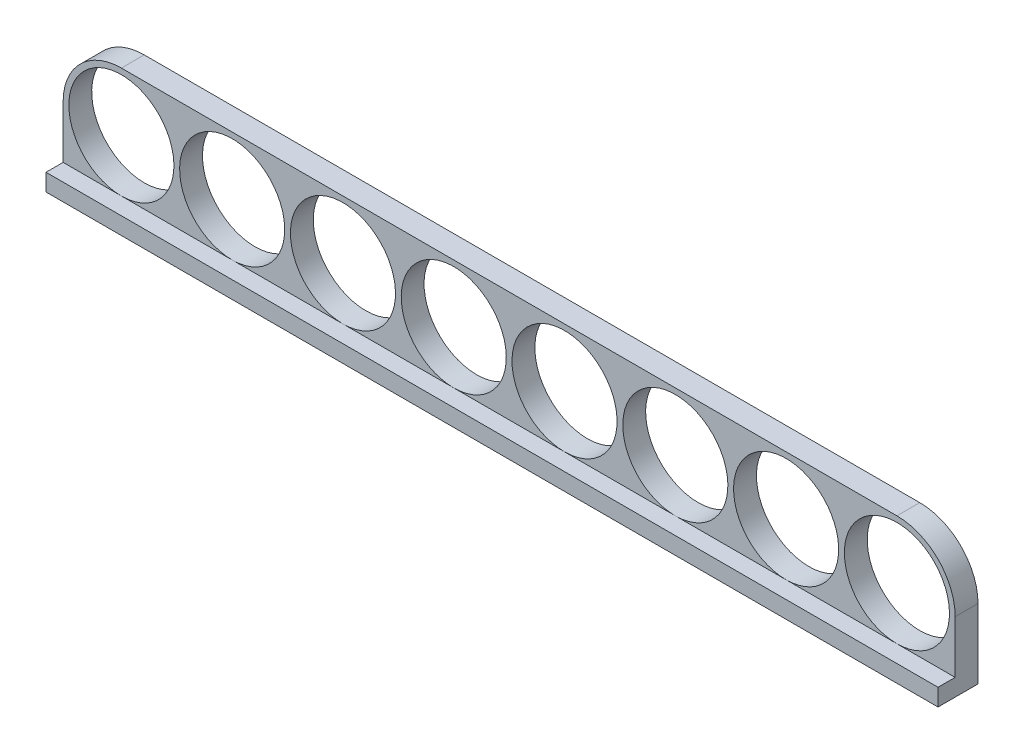
ISO-10303-21;
HEADER;
FILE_DESCRIPTION(('STEP AP214'),'2;1');
FILE_NAME('part.step','',(''),(''),'','','');
FILE_SCHEMA(('AUTOMOTIVE_DESIGN { 1 0 10303 214 1 1 1 1 }'));
ENDSEC;
DATA;
#1=APPLICATION_CONTEXT('core data for automotive mechanical design processes');
#2=APPLICATION_PROTOCOL_DEFINITION('international standard','automotive_design',2000,#1);
#3=PRODUCT_CONTEXT('',#1,'mechanical');
#4=PRODUCT('Part','Part','',(#3));
#5=PRODUCT_RELATED_PRODUCT_CATEGORY('part','',(#4));
#6=PRODUCT_DEFINITION_FORMATION('','',#4);
#7=PRODUCT_DEFINITION_CONTEXT('part definition',#1,'design');
#8=PRODUCT_DEFINITION('design','',#6,#7);
#9=PRODUCT_DEFINITION_SHAPE('','',#8);
#10=(LENGTH_UNIT() NAMED_UNIT(*) SI_UNIT(.MILLI.,.METRE.));
#11=(NAMED_UNIT(*) PLANE_ANGLE_UNIT() SI_UNIT($,.RADIAN.));
#12=(NAMED_UNIT(*) SI_UNIT($,.STERADIAN.) SOLID_ANGLE_UNIT());
#13=UNCERTAINTY_MEASURE_WITH_UNIT(LENGTH_MEASURE(1.E-05),#10,'distance_accuracy_value','');
#14=(GEOMETRIC_REPRESENTATION_CONTEXT(3) GLOBAL_UNCERTAINTY_ASSIGNED_CONTEXT((#13)) GLOBAL_UNIT_ASSIGNED_CONTEXT((#10,
#11,#12)) REPRESENTATION_CONTEXT('',''));
#15=CARTESIAN_POINT('',(0.,0.,0.));
#16=DIRECTION('',(0.,0.,1.));
#17=DIRECTION('',(1.,0.,0.));
#18=AXIS2_PLACEMENT_3D('',#15,#16,#17);
#19=CARTESIAN_POINT('',(0.,10.2,4.));
#20=DIRECTION('',(0.,1.,0.));
#21=DIRECTION('',(0.,0.,1.));
#22=AXIS2_PLACEMENT_3D('',#19,#20,#21);
#23=PLANE('',#22);
#24=DIRECTION('',(1.,0.,0.));
#25=VECTOR('',#24,1.);
#26=CARTESIAN_POINT('',(0.,10.2,0.));
#27=LINE('',#26,#25);
#28=CARTESIAN_POINT('',(0.,10.2,0.));
#29=VERTEX_POINT('',#28);
#30=CARTESIAN_POINT('',(135.8,10.2,0.));
#31=VERTEX_POINT('',#30);
#32=EDGE_CURVE('E265',#29,#31,#27,.T.);
#33=ORIENTED_EDGE('',*,*,#32,.F.);
#34=DIRECTION('',(0.,0.,-1.));
#35=VECTOR('',#34,1.);
#36=CARTESIAN_POINT('',(0.,10.2,4.));
#37=LINE('',#36,#35);
#38=CARTESIAN_POINT('',(0.,10.2,4.));
#39=VERTEX_POINT('',#38);
#40=EDGE_CURVE('E51',#39,#29,#37,.T.);
#41=ORIENTED_EDGE('',*,*,#40,.F.);
#42=DIRECTION('',(1.,0.,0.));
#43=VECTOR('',#42,1.);
#44=CARTESIAN_POINT('',(0.,10.2,4.));
#45=LINE('',#44,#43);
#46=CARTESIAN_POINT('',(135.8,10.2,4.));
#47=VERTEX_POINT('',#46);
#48=EDGE_CURVE('E215',#39,#47,#45,.T.);
#49=ORIENTED_EDGE('',*,*,#48,.T.);
#50=DIRECTION('',(0.,0.,-1.));
#51=VECTOR('',#50,1.);
#52=CARTESIAN_POINT('',(135.8,10.2,4.));
#53=LINE('',#52,#51);
#54=EDGE_CURVE('E233',#47,#31,#53,.T.);
#55=ORIENTED_EDGE('',*,*,#54,.T.);
#56=EDGE_LOOP('',(#33,#41,#49,#55));
#57=FACE_BOUND('',#56,.T.);
#58=ADVANCED_FACE('F47',(#57),#23,.T.);
#59=CARTESIAN_POINT('',(0.,0.,4.));
#60=DIRECTION('',(0.,0.,-1.));
#61=DIRECTION('',(-1.,0.,0.));
#62=AXIS2_PLACEMENT_3D('',#59,#60,#61);
#63=CYLINDRICAL_SURFACE('',#62,10.2);
#64=CARTESIAN_POINT('',(0.,0.,0.));
#65=DIRECTION('',(0.,0.,1.));
#66=DIRECTION('',(1.,0.,0.));
#67=AXIS2_PLACEMENT_3D('',#64,#65,#66);
#68=CIRCLE('',#67,10.2);
#69=CARTESIAN_POINT('',(-10.2,0.,0.));
#70=VERTEX_POINT('',#69);
#71=EDGE_CURVE('E269',#29,#70,#68,.T.);
#72=ORIENTED_EDGE('',*,*,#71,.T.);
#73=DIRECTION('',(0.,0.,-1.));
#74=VECTOR('',#73,1.);
#75=CARTESIAN_POINT('',(-10.2,0.,4.));
#76=LINE('',#75,#74);
#77=CARTESIAN_POINT('',(-10.2,0.,4.));
#78=VERTEX_POINT('',#77);
#79=EDGE_CURVE('E150',#78,#70,#76,.T.);
#80=ORIENTED_EDGE('',*,*,#79,.F.);
#81=CARTESIAN_POINT('',(0.,0.,4.));
#82=DIRECTION('',(0.,0.,1.));
#83=DIRECTION('',(1.,0.,0.));
#84=AXIS2_PLACEMENT_3D('',#81,#82,#83);
#85=CIRCLE('',#84,10.2);
#86=EDGE_CURVE('E219',#39,#78,#85,.T.);
#87=ORIENTED_EDGE('',*,*,#86,.F.);
#88=ORIENTED_EDGE('',*,*,#40,.T.);
#89=EDGE_LOOP('',(#72,#80,#87,#88));
#90=FACE_BOUND('',#89,.T.);
#91=ADVANCED_FACE('F347',(#90),#63,.T.);
#92=CARTESIAN_POINT('',(-10.2,0.,4.));
#93=DIRECTION('',(1.,0.,0.));
#94=DIRECTION('',(0.,1.,0.));
#95=AXIS2_PLACEMENT_3D('',#92,#93,#94);
#96=PLANE('',#95);
#97=DIRECTION('',(0.,-1.,0.));
#98=VECTOR('',#97,1.);
#99=CARTESIAN_POINT('',(-10.2,0.,0.));
#100=LINE('',#99,#98);
#101=CARTESIAN_POINT('',(-10.2,-12.2,0.));
#102=VERTEX_POINT('',#101);
#103=EDGE_CURVE('E146',#70,#102,#100,.T.);
#104=ORIENTED_EDGE('',*,*,#103,.T.);
#105=DIRECTION('',(0.,0.,-1.));
#106=VECTOR('',#105,1.);
#107=CARTESIAN_POINT('',(-10.2,-12.2,4.));
#108=LINE('',#107,#106);
#109=CARTESIAN_POINT('',(-10.2,-12.2,7.));
#110=VERTEX_POINT('',#109);
#111=EDGE_CURVE('E139',#110,#102,#108,.T.);
#112=ORIENTED_EDGE('',*,*,#111,.F.);
#113=DIRECTION('',(0.,-1.,0.));
#114=VECTOR('',#113,1.);
#115=CARTESIAN_POINT('',(-10.2,-12.2,7.));
#116=LINE('',#115,#114);
#117=CARTESIAN_POINT('',(-10.2,-9.2,7.));
#118=VERTEX_POINT('',#117);
#119=EDGE_CURVE('E144',#118,#110,#116,.T.);
#120=ORIENTED_EDGE('',*,*,#119,.F.);
#121=DIRECTION('',(0.,0.,-1.));
#122=VECTOR('',#121,1.);
#123=CARTESIAN_POINT('',(-10.2,-9.2,7.));
#124=LINE('',#123,#122);
#125=CARTESIAN_POINT('',(-10.2,-9.2,4.));
#126=VERTEX_POINT('',#125);
#127=EDGE_CURVE('E174',#118,#126,#124,.T.);
#128=ORIENTED_EDGE('',*,*,#127,.T.);
#129=DIRECTION('',(0.,-1.,0.));
#130=VECTOR('',#129,1.);
#131=CARTESIAN_POINT('',(-10.2,0.,4.));
#132=LINE('',#131,#130);
#133=EDGE_CURVE('E223',#78,#126,#132,.T.);
#134=ORIENTED_EDGE('',*,*,#133,.F.);
#135=ORIENTED_EDGE('',*,*,#79,.T.);
#136=EDGE_LOOP('',(#104,#112,#120,#128,#134,#135));
#137=FACE_BOUND('',#136,.T.);
#138=ADVANCED_FACE('F141',(#137),#96,.F.);
#139=CARTESIAN_POINT('',(0.,-12.2,4.));
#140=DIRECTION('',(0.,1.,0.));
#141=DIRECTION('',(0.,0.,1.));
#142=AXIS2_PLACEMENT_3D('',#139,#140,#141);
#143=PLANE('',#142);
#144=DIRECTION('',(1.,0.,0.));
#145=VECTOR('',#144,1.);
#146=CARTESIAN_POINT('',(0.,-12.2,0.));
#147=LINE('',#146,#145);
#148=CARTESIAN_POINT('',(146.,-12.2,0.));
#149=VERTEX_POINT('',#148);
#150=EDGE_CURVE('E275',#102,#149,#147,.T.);
#151=ORIENTED_EDGE('',*,*,#150,.T.);
#152=DIRECTION('',(0.,0.,-1.));
#153=VECTOR('',#152,1.);
#154=CARTESIAN_POINT('',(146.,-12.2,4.));
#155=LINE('',#154,#153);
#156=CARTESIAN_POINT('',(146.,-12.2,7.));
#157=VERTEX_POINT('',#156);
#158=EDGE_CURVE('E151',#157,#149,#155,.T.);
#159=ORIENTED_EDGE('',*,*,#158,.F.);
#160=DIRECTION('',(1.,0.,0.));
#161=VECTOR('',#160,1.);
#162=CARTESIAN_POINT('',(-10.2,-12.2,7.));
#163=LINE('',#162,#161);
#164=EDGE_CURVE('E154',#110,#157,#163,.T.);
#165=ORIENTED_EDGE('',*,*,#164,.F.);
#166=ORIENTED_EDGE('',*,*,#111,.T.);
#167=EDGE_LOOP('',(#151,#159,#165,#166));
#168=FACE_BOUND('',#167,.T.);
#169=ADVANCED_FACE('F155',(#168),#143,.F.);
#170=CARTESIAN_POINT('',(146.,0.,4.));
#171=DIRECTION('',(-1.,0.,0.));
#172=DIRECTION('',(0.,0.,1.));
#173=AXIS2_PLACEMENT_3D('',#170,#171,#172);
#174=PLANE('',#173);
#175=DIRECTION('',(0.,1.,0.));
#176=VECTOR('',#175,1.);
#177=CARTESIAN_POINT('',(146.,0.,0.));
#178=LINE('',#177,#176);
#179=CARTESIAN_POINT('',(146.,0.,0.));
#180=VERTEX_POINT('',#179);
#181=EDGE_CURVE('E278',#149,#180,#178,.T.);
#182=ORIENTED_EDGE('',*,*,#181,.T.);
#183=DIRECTION('',(0.,0.,-1.));
#184=VECTOR('',#183,1.);
#185=CARTESIAN_POINT('',(146.,0.,4.));
#186=LINE('',#185,#184);
#187=CARTESIAN_POINT('',(146.,0.,4.));
#188=VERTEX_POINT('',#187);
#189=EDGE_CURVE('E287',#188,#180,#186,.T.);
#190=ORIENTED_EDGE('',*,*,#189,.F.);
#191=DIRECTION('',(0.,1.,0.));
#192=VECTOR('',#191,1.);
#193=CARTESIAN_POINT('',(146.,0.,4.));
#194=LINE('',#193,#192);
#195=CARTESIAN_POINT('',(146.,-9.2,4.));
#196=VERTEX_POINT('',#195);
#197=EDGE_CURVE('E226',#196,#188,#194,.T.);
#198=ORIENTED_EDGE('',*,*,#197,.F.);
#199=DIRECTION('',(0.,0.,-1.));
#200=VECTOR('',#199,1.);
#201=CARTESIAN_POINT('',(146.,-9.2,7.));
#202=LINE('',#201,#200);
#203=CARTESIAN_POINT('',(146.,-9.2,7.));
#204=VERTEX_POINT('',#203);
#205=EDGE_CURVE('E178',#204,#196,#202,.T.);
#206=ORIENTED_EDGE('',*,*,#205,.F.);
#207=DIRECTION('',(0.,1.,0.));
#208=VECTOR('',#207,1.);
#209=CARTESIAN_POINT('',(146.,-12.2,7.));
#210=LINE('',#209,#208);
#211=EDGE_CURVE('E160',#157,#204,#210,.T.);
#212=ORIENTED_EDGE('',*,*,#211,.F.);
#213=ORIENTED_EDGE('',*,*,#158,.T.);
#214=EDGE_LOOP('',(#182,#190,#198,#206,#212,#213));
#215=FACE_BOUND('',#214,.T.);
#216=ADVANCED_FACE('F344',(#215),#174,.F.);
#217=CARTESIAN_POINT('',(135.8,0.,4.));
#218=DIRECTION('',(0.,0.,-1.));
#219=DIRECTION('',(-1.,0.,0.));
#220=AXIS2_PLACEMENT_3D('',#217,#218,#219);
#221=CYLINDRICAL_SURFACE('',#220,9.2);
#222=CARTESIAN_POINT('',(135.8,0.,4.));
#223=DIRECTION('',(0.,0.,1.));
#224=DIRECTION('',(1.,0.,0.));
#225=AXIS2_PLACEMENT_3D('',#222,#223,#224);
#226=CIRCLE('',#225,9.2);
#227=CARTESIAN_POINT('',(135.8,-9.2,4.));
#228=VERTEX_POINT('',#227);
#229=EDGE_CURVE('E212',#228,#228,#226,.T.);
#230=ORIENTED_EDGE('',*,*,#229,.T.);
#231=EDGE_LOOP('',(#230));
#232=FACE_BOUND('',#231,.T.);
#233=CARTESIAN_POINT('',(135.8,0.,0.));
#234=DIRECTION('',(0.,0.,1.));
#235=DIRECTION('',(1.,0.,0.));
#236=AXIS2_PLACEMENT_3D('',#233,#234,#235);
#237=CIRCLE('',#236,9.2);
#238=CARTESIAN_POINT('',(145.,0.,0.));
#239=VERTEX_POINT('',#238);
#240=EDGE_CURVE('E261',#239,#239,#237,.T.);
#241=ORIENTED_EDGE('',*,*,#240,.F.);
#242=EDGE_LOOP('',(#241));
#243=FACE_BOUND('',#242,.T.);
#244=ADVANCED_FACE('F325',(#232,#243),#221,.F.);
#245=CARTESIAN_POINT('',(116.4,0.,4.));
#246=DIRECTION('',(0.,0.,-1.));
#247=DIRECTION('',(-1.,0.,0.));
#248=AXIS2_PLACEMENT_3D('',#245,#246,#247);
#249=CYLINDRICAL_SURFACE('',#248,9.2);
#250=CARTESIAN_POINT('',(116.4,0.,4.));
#251=DIRECTION('',(0.,0.,1.));
#252=DIRECTION('',(1.,0.,0.));
#253=AXIS2_PLACEMENT_3D('',#250,#251,#252);
#254=CIRCLE('',#253,9.2);
#255=CARTESIAN_POINT('',(116.4,-9.2,4.));
#256=VERTEX_POINT('',#255);
#257=EDGE_CURVE('E208',#256,#256,#254,.T.);
#258=ORIENTED_EDGE('',*,*,#257,.T.);
#259=EDGE_LOOP('',(#258));
#260=FACE_BOUND('',#259,.T.);
#261=CARTESIAN_POINT('',(116.4,0.,0.));
#262=DIRECTION('',(0.,0.,1.));
#263=DIRECTION('',(1.,0.,0.));
#264=AXIS2_PLACEMENT_3D('',#261,#262,#263);
#265=CIRCLE('',#264,9.2);
#266=CARTESIAN_POINT('',(125.6,0.,0.));
#267=VERTEX_POINT('',#266);
#268=EDGE_CURVE('E257',#267,#267,#265,.T.);
#269=ORIENTED_EDGE('',*,*,#268,.F.);
#270=EDGE_LOOP('',(#269));
#271=FACE_BOUND('',#270,.T.);
#272=ADVANCED_FACE('F321',(#260,#271),#249,.F.);
#273=CARTESIAN_POINT('',(97.,0.,4.));
#274=DIRECTION('',(0.,0.,-1.));
#275=DIRECTION('',(-1.,0.,0.));
#276=AXIS2_PLACEMENT_3D('',#273,#274,#275);
#277=CYLINDRICAL_SURFACE('',#276,9.2);
#278=CARTESIAN_POINT('',(97.,0.,4.));
#279=DIRECTION('',(0.,0.,1.));
#280=DIRECTION('',(1.,0.,0.));
#281=AXIS2_PLACEMENT_3D('',#278,#279,#280);
#282=CIRCLE('',#281,9.2);
#283=CARTESIAN_POINT('',(97.,-9.2,4.));
#284=VERTEX_POINT('',#283);
#285=EDGE_CURVE('E204',#284,#284,#282,.T.);
#286=ORIENTED_EDGE('',*,*,#285,.T.);
#287=EDGE_LOOP('',(#286));
#288=FACE_BOUND('',#287,.T.);
#289=CARTESIAN_POINT('',(97.,0.,0.));
#290=DIRECTION('',(0.,0.,1.));
#291=DIRECTION('',(1.,0.,0.));
#292=AXIS2_PLACEMENT_3D('',#289,#290,#291);
#293=CIRCLE('',#292,9.2);
#294=CARTESIAN_POINT('',(106.2,0.,0.));
#295=VERTEX_POINT('',#294);
#296=EDGE_CURVE('E253',#295,#295,#293,.T.);
#297=ORIENTED_EDGE('',*,*,#296,.F.);
#298=EDGE_LOOP('',(#297));
#299=FACE_BOUND('',#298,.T.);
#300=ADVANCED_FACE('F324',(#288,#299),#277,.F.);
#301=CARTESIAN_POINT('',(77.6,0.,4.));
#302=DIRECTION('',(0.,0.,-1.));
#303=DIRECTION('',(-1.,0.,0.));
#304=AXIS2_PLACEMENT_3D('',#301,#302,#303);
#305=CYLINDRICAL_SURFACE('',#304,9.2);
#306=CARTESIAN_POINT('',(77.6,0.,4.));
#307=DIRECTION('',(0.,0.,1.));
#308=DIRECTION('',(1.,0.,0.));
#309=AXIS2_PLACEMENT_3D('',#306,#307,#308);
#310=CIRCLE('',#309,9.2);
#311=CARTESIAN_POINT('',(77.6,-9.2,4.));
#312=VERTEX_POINT('',#311);
#313=EDGE_CURVE('E200',#312,#312,#310,.T.);
#314=ORIENTED_EDGE('',*,*,#313,.T.);
#315=EDGE_LOOP('',(#314));
#316=FACE_BOUND('',#315,.T.);
#317=CARTESIAN_POINT('',(77.6,0.,0.));
#318=DIRECTION('',(0.,0.,1.));
#319=DIRECTION('',(1.,0.,0.));
#320=AXIS2_PLACEMENT_3D('',#317,#318,#319);
#321=CIRCLE('',#320,9.2);
#322=CARTESIAN_POINT('',(86.8,0.,0.));
#323=VERTEX_POINT('',#322);
#324=EDGE_CURVE('E249',#323,#323,#321,.T.);
#325=ORIENTED_EDGE('',*,*,#324,.F.);
#326=EDGE_LOOP('',(#325));
#327=FACE_BOUND('',#326,.T.);
#328=ADVANCED_FACE('F363',(#316,#327),#305,.F.);
#329=CARTESIAN_POINT('',(58.2,0.,4.));
#330=DIRECTION('',(0.,0.,-1.));
#331=DIRECTION('',(-1.,0.,0.));
#332=AXIS2_PLACEMENT_3D('',#329,#330,#331);
#333=CYLINDRICAL_SURFACE('',#332,9.2);
#334=CARTESIAN_POINT('',(58.2,0.,4.));
#335=DIRECTION('',(0.,0.,1.));
#336=DIRECTION('',(1.,0.,0.));
#337=AXIS2_PLACEMENT_3D('',#334,#335,#336);
#338=CIRCLE('',#337,9.2);
#339=CARTESIAN_POINT('',(58.2,-9.2,4.));
#340=VERTEX_POINT('',#339);
#341=EDGE_CURVE('E196',#340,#340,#338,.T.);
#342=ORIENTED_EDGE('',*,*,#341,.T.);
#343=EDGE_LOOP('',(#342));
#344=FACE_BOUND('',#343,.T.);
#345=CARTESIAN_POINT('',(58.2,0.,0.));
#346=DIRECTION('',(0.,0.,1.));
#347=DIRECTION('',(1.,0.,0.));
#348=AXIS2_PLACEMENT_3D('',#345,#346,#347);
#349=CIRCLE('',#348,9.2);
#350=CARTESIAN_POINT('',(67.4,0.,0.));
#351=VERTEX_POINT('',#350);
#352=EDGE_CURVE('E245',#351,#351,#349,.T.);
#353=ORIENTED_EDGE('',*,*,#352,.F.);
#354=EDGE_LOOP('',(#353));
#355=FACE_BOUND('',#354,.T.);
#356=ADVANCED_FACE('F367',(#344,#355),#333,.F.);
#357=CARTESIAN_POINT('',(38.8,0.,4.));
#358=DIRECTION('',(0.,0.,-1.));
#359=DIRECTION('',(-1.,0.,0.));
#360=AXIS2_PLACEMENT_3D('',#357,#358,#359);
#361=CYLINDRICAL_SURFACE('',#360,9.2);
#362=CARTESIAN_POINT('',(38.8,0.,4.));
#363=DIRECTION('',(0.,0.,1.));
#364=DIRECTION('',(1.,0.,0.));
#365=AXIS2_PLACEMENT_3D('',#362,#363,#364);
#366=CIRCLE('',#365,9.2);
#367=CARTESIAN_POINT('',(38.8,-9.2,4.));
#368=VERTEX_POINT('',#367);
#369=EDGE_CURVE('E192',#368,#368,#366,.T.);
#370=ORIENTED_EDGE('',*,*,#369,.T.);
#371=EDGE_LOOP('',(#370));
#372=FACE_BOUND('',#371,.T.);
#373=CARTESIAN_POINT('',(38.8,0.,0.));
#374=DIRECTION('',(0.,0.,1.));
#375=DIRECTION('',(1.,0.,0.));
#376=AXIS2_PLACEMENT_3D('',#373,#374,#375);
#377=CIRCLE('',#376,9.2);
#378=CARTESIAN_POINT('',(48.,0.,0.));
#379=VERTEX_POINT('',#378);
#380=EDGE_CURVE('E241',#379,#379,#377,.T.);
#381=ORIENTED_EDGE('',*,*,#380,.F.);
#382=EDGE_LOOP('',(#381));
#383=FACE_BOUND('',#382,.T.);
#384=ADVANCED_FACE('F371',(#372,#383),#361,.F.);
#385=CARTESIAN_POINT('',(19.4,0.,4.));
#386=DIRECTION('',(0.,0.,-1.));
#387=DIRECTION('',(-1.,0.,0.));
#388=AXIS2_PLACEMENT_3D('',#385,#386,#387);
#389=CYLINDRICAL_SURFACE('',#388,9.2);
#390=CARTESIAN_POINT('',(19.4,0.,4.));
#391=DIRECTION('',(0.,0.,1.));
#392=DIRECTION('',(1.,0.,0.));
#393=AXIS2_PLACEMENT_3D('',#390,#391,#392);
#394=CIRCLE('',#393,9.2);
#395=CARTESIAN_POINT('',(19.4,-9.2,4.));
#396=VERTEX_POINT('',#395);
#397=EDGE_CURVE('E187',#396,#396,#394,.T.);
#398=ORIENTED_EDGE('',*,*,#397,.T.);
#399=EDGE_LOOP('',(#398));
#400=FACE_BOUND('',#399,.T.);
#401=CARTESIAN_POINT('',(19.4,0.,0.));
#402=DIRECTION('',(0.,0.,1.));
#403=DIRECTION('',(1.,0.,0.));
#404=AXIS2_PLACEMENT_3D('',#401,#402,#403);
#405=CIRCLE('',#404,9.2);
#406=CARTESIAN_POINT('',(28.6,0.,0.));
#407=VERTEX_POINT('',#406);
#408=EDGE_CURVE('E237',#407,#407,#405,.T.);
#409=ORIENTED_EDGE('',*,*,#408,.F.);
#410=EDGE_LOOP('',(#409));
#411=FACE_BOUND('',#410,.T.);
#412=ADVANCED_FACE('F374',(#400,#411),#389,.F.);
#413=CARTESIAN_POINT('',(0.,0.,4.));
#414=DIRECTION('',(0.,0.,-1.));
#415=DIRECTION('',(-1.,0.,0.));
#416=AXIS2_PLACEMENT_3D('',#413,#414,#415);
#417=CYLINDRICAL_SURFACE('',#416,9.2);
#418=CARTESIAN_POINT('',(0.,0.,4.));
#419=DIRECTION('',(0.,0.,1.));
#420=DIRECTION('',(1.,0.,0.));
#421=AXIS2_PLACEMENT_3D('',#418,#419,#420);
#422=CIRCLE('',#421,9.2);
#423=CARTESIAN_POINT('',(0.,-9.2,4.));
#424=VERTEX_POINT('',#423);
#425=EDGE_CURVE('E183',#424,#424,#422,.T.);
#426=ORIENTED_EDGE('',*,*,#425,.T.);
#427=EDGE_LOOP('',(#426));
#428=FACE_BOUND('',#427,.T.);
#429=CARTESIAN_POINT('',(0.,0.,0.));
#430=DIRECTION('',(0.,0.,1.));
#431=DIRECTION('',(1.,0.,0.));
#432=AXIS2_PLACEMENT_3D('',#429,#430,#431);
#433=CIRCLE('',#432,9.2);
#434=CARTESIAN_POINT('',(9.2,0.,0.));
#435=VERTEX_POINT('',#434);
#436=EDGE_CURVE('E182',#435,#435,#433,.T.);
#437=ORIENTED_EDGE('',*,*,#436,.F.);
#438=EDGE_LOOP('',(#437));
#439=FACE_BOUND('',#438,.T.);
#440=ADVANCED_FACE('F49',(#428,#439),#417,.F.);
#441=CARTESIAN_POINT('',(135.8,0.,4.));
#442=DIRECTION('',(0.,0.,-1.));
#443=DIRECTION('',(-1.,0.,0.));
#444=AXIS2_PLACEMENT_3D('',#441,#442,#443);
#445=CYLINDRICAL_SURFACE('',#444,10.2);
#446=CARTESIAN_POINT('',(135.8,0.,0.));
#447=DIRECTION('',(0.,0.,1.));
#448=DIRECTION('',(1.,0.,0.));
#449=AXIS2_PLACEMENT_3D('',#446,#447,#448);
#450=CIRCLE('',#449,10.2);
#451=EDGE_CURVE('E188',#31,#180,#450,.F.);
#452=ORIENTED_EDGE('',*,*,#451,.F.);
#453=ORIENTED_EDGE('',*,*,#54,.F.);
#454=CARTESIAN_POINT('',(135.8,0.,4.));
#455=DIRECTION('',(0.,0.,1.));
#456=DIRECTION('',(1.,0.,0.));
#457=AXIS2_PLACEMENT_3D('',#454,#455,#456);
#458=CIRCLE('',#457,10.2);
#459=EDGE_CURVE('E229',#47,#188,#458,.F.);
#460=ORIENTED_EDGE('',*,*,#459,.T.);
#461=ORIENTED_EDGE('',*,*,#189,.T.);
#462=EDGE_LOOP('',(#452,#453,#460,#461));
#463=FACE_BOUND('',#462,.T.);
#464=ADVANCED_FACE('F340',(#463),#445,.T.);
#465=CARTESIAN_POINT('',(0.,0.,4.));
#466=DIRECTION('',(0.,0.,1.));
#467=DIRECTION('',(1.,0.,0.));
#468=AXIS2_PLACEMENT_3D('',#465,#466,#467);
#469=PLANE('',#468);
#470=DIRECTION('',(-1.,0.,0.));
#471=VECTOR('',#470,1.);
#472=CARTESIAN_POINT('',(-10.2,-9.2,4.));
#473=LINE('',#472,#471);
#474=EDGE_CURVE('E59',#196,#228,#473,.T.);
#475=ORIENTED_EDGE('',*,*,#474,.F.);
#476=ORIENTED_EDGE('',*,*,#197,.T.);
#477=ORIENTED_EDGE('',*,*,#459,.F.);
#478=ORIENTED_EDGE('',*,*,#48,.F.);
#479=ORIENTED_EDGE('',*,*,#86,.T.);
#480=ORIENTED_EDGE('',*,*,#133,.T.);
#481=EDGE_CURVE('E169',#424,#126,#473,.T.);
#482=ORIENTED_EDGE('',*,*,#481,.F.);
#483=ORIENTED_EDGE('',*,*,#425,.F.);
#484=EDGE_CURVE('E299',#396,#424,#473,.T.);
#485=ORIENTED_EDGE('',*,*,#484,.F.);
#486=ORIENTED_EDGE('',*,*,#397,.F.);
#487=EDGE_CURVE('E303',#368,#396,#473,.T.);
#488=ORIENTED_EDGE('',*,*,#487,.F.);
#489=ORIENTED_EDGE('',*,*,#369,.F.);
#490=EDGE_CURVE('E306',#340,#368,#473,.T.);
#491=ORIENTED_EDGE('',*,*,#490,.F.);
#492=ORIENTED_EDGE('',*,*,#341,.F.);
#493=EDGE_CURVE('E309',#312,#340,#473,.T.);
#494=ORIENTED_EDGE('',*,*,#493,.F.);
#495=ORIENTED_EDGE('',*,*,#313,.F.);
#496=EDGE_CURVE('E312',#284,#312,#473,.T.);
#497=ORIENTED_EDGE('',*,*,#496,.F.);
#498=ORIENTED_EDGE('',*,*,#285,.F.);
#499=EDGE_CURVE('E57',#256,#284,#473,.T.);
#500=ORIENTED_EDGE('',*,*,#499,.F.);
#501=ORIENTED_EDGE('',*,*,#257,.F.);
#502=EDGE_CURVE('E11',#228,#256,#473,.T.);
#503=ORIENTED_EDGE('',*,*,#502,.F.);
#504=ORIENTED_EDGE('',*,*,#229,.F.);
#505=EDGE_LOOP('',(#475,#476,#477,#478,#479,#480,#482,#483,#485,#486,#488,#489,#491,#492,#494,
#495,#497,#498,#500,#501,#503,#504));
#506=FACE_BOUND('',#505,.T.);
#507=ADVANCED_FACE('F319',(#506),#469,.T.);
#508=CARTESIAN_POINT('',(0.,0.,0.));
#509=DIRECTION('',(0.,0.,1.));
#510=DIRECTION('',(1.,0.,0.));
#511=AXIS2_PLACEMENT_3D('',#508,#509,#510);
#512=PLANE('',#511);
#513=ORIENTED_EDGE('',*,*,#436,.T.);
#514=EDGE_LOOP('',(#513));
#515=FACE_BOUND('',#514,.T.);
#516=ORIENTED_EDGE('',*,*,#408,.T.);
#517=EDGE_LOOP('',(#516));
#518=FACE_BOUND('',#517,.T.);
#519=ORIENTED_EDGE('',*,*,#380,.T.);
#520=EDGE_LOOP('',(#519));
#521=FACE_BOUND('',#520,.T.);
#522=ORIENTED_EDGE('',*,*,#352,.T.);
#523=EDGE_LOOP('',(#522));
#524=FACE_BOUND('',#523,.T.);
#525=ORIENTED_EDGE('',*,*,#324,.T.);
#526=EDGE_LOOP('',(#525));
#527=FACE_BOUND('',#526,.T.);
#528=ORIENTED_EDGE('',*,*,#296,.T.);
#529=EDGE_LOOP('',(#528));
#530=FACE_BOUND('',#529,.T.);
#531=ORIENTED_EDGE('',*,*,#268,.T.);
#532=EDGE_LOOP('',(#531));
#533=FACE_BOUND('',#532,.T.);
#534=ORIENTED_EDGE('',*,*,#240,.T.);
#535=EDGE_LOOP('',(#534));
#536=FACE_BOUND('',#535,.T.);
#537=ORIENTED_EDGE('',*,*,#32,.T.);
#538=ORIENTED_EDGE('',*,*,#451,.T.);
#539=ORIENTED_EDGE('',*,*,#181,.F.);
#540=ORIENTED_EDGE('',*,*,#150,.F.);
#541=ORIENTED_EDGE('',*,*,#103,.F.);
#542=ORIENTED_EDGE('',*,*,#71,.F.);
#543=EDGE_LOOP('',(#537,#538,#539,#540,#541,#542));
#544=FACE_BOUND('',#543,.T.);
#545=ADVANCED_FACE('F329',(#515,#518,#521,#524,#527,#530,#533,#536,#544),#512,.F.);
#546=CARTESIAN_POINT('',(-10.2,-9.2,7.));
#547=DIRECTION('',(0.,-1.,0.));
#548=DIRECTION('',(0.,0.,-1.));
#549=AXIS2_PLACEMENT_3D('',#546,#547,#548);
#550=PLANE('',#549);
#551=ORIENTED_EDGE('',*,*,#474,.T.);
#552=ORIENTED_EDGE('',*,*,#502,.T.);
#553=ORIENTED_EDGE('',*,*,#499,.T.);
#554=ORIENTED_EDGE('',*,*,#496,.T.);
#555=ORIENTED_EDGE('',*,*,#493,.T.);
#556=ORIENTED_EDGE('',*,*,#490,.T.);
#557=ORIENTED_EDGE('',*,*,#487,.T.);
#558=ORIENTED_EDGE('',*,*,#484,.T.);
#559=ORIENTED_EDGE('',*,*,#481,.T.);
#560=ORIENTED_EDGE('',*,*,#127,.F.);
#561=DIRECTION('',(-1.,0.,0.));
#562=VECTOR('',#561,1.);
#563=CARTESIAN_POINT('',(-10.2,-9.2,7.));
#564=LINE('',#563,#562);
#565=EDGE_CURVE('E164',#204,#118,#564,.T.);
#566=ORIENTED_EDGE('',*,*,#565,.F.);
#567=ORIENTED_EDGE('',*,*,#205,.T.);
#568=EDGE_LOOP('',(#551,#552,#553,#554,#555,#556,#557,#558,#559,#560,#566,#567));
#569=FACE_BOUND('',#568,.T.);
#570=ADVANCED_FACE('F317',(#569),#550,.F.);
#571=CARTESIAN_POINT('',(0.,0.,7.));
#572=DIRECTION('',(0.,0.,-1.));
#573=DIRECTION('',(-1.,0.,0.));
#574=AXIS2_PLACEMENT_3D('',#571,#572,#573);
#575=PLANE('',#574);
#576=ORIENTED_EDGE('',*,*,#119,.T.);
#577=ORIENTED_EDGE('',*,*,#164,.T.);
#578=ORIENTED_EDGE('',*,*,#211,.T.);
#579=ORIENTED_EDGE('',*,*,#565,.T.);
#580=EDGE_LOOP('',(#576,#577,#578,#579));
#581=FACE_BOUND('',#580,.T.);
#582=ADVANCED_FACE('F162',(#581),#575,.F.);
#583=CLOSED_SHELL('',(#58,#91,#138,#169,#216,#244,#272,#300,#328,#356,#384,#412,#440,#464,#507,
#545,#570,#582));
#584=MANIFOLD_SOLID_BREP('B2',#583);
#585=ADVANCED_BREP_SHAPE_REPRESENTATION('',(#18,#584),#14);
#586=SHAPE_DEFINITION_REPRESENTATION(#9,#585);
ENDSEC;
END-ISO-10303-21;
